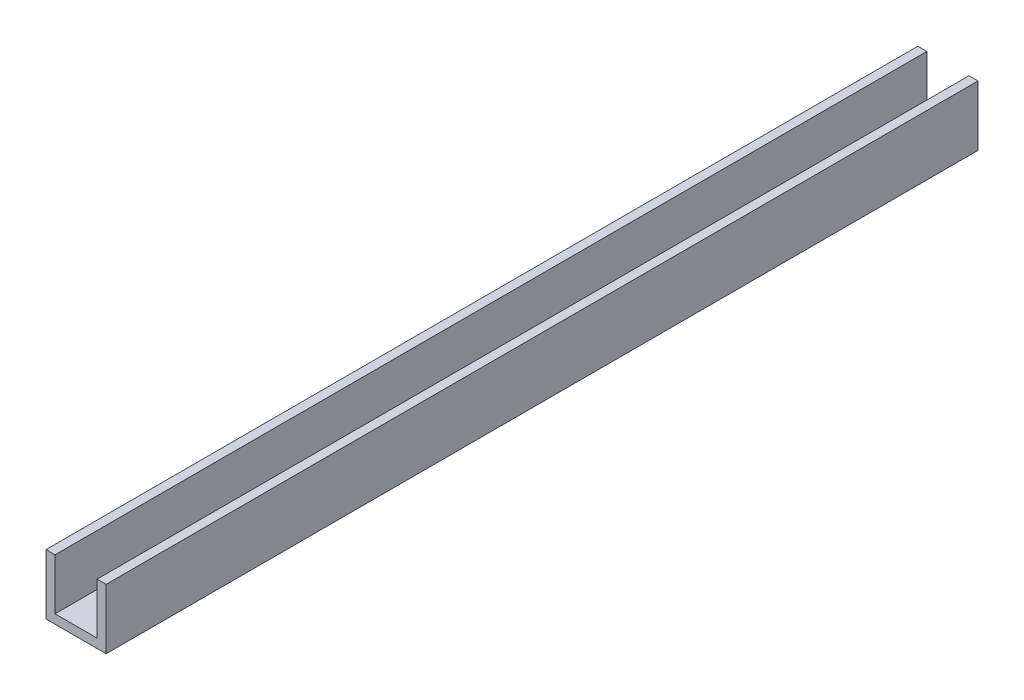
ISO-10303-21;
HEADER;
FILE_DESCRIPTION(('STEP AP214'),'2;1');
FILE_NAME('part.step','',(''),(''),'','','');
FILE_SCHEMA(('AUTOMOTIVE_DESIGN { 1 0 10303 214 1 1 1 1 }'));
ENDSEC;
DATA;
#1=APPLICATION_CONTEXT('core data for automotive mechanical design processes');
#2=APPLICATION_PROTOCOL_DEFINITION('international standard','automotive_design',2000,#1);
#3=PRODUCT_CONTEXT('',#1,'mechanical');
#4=PRODUCT('Part','Part','',(#3));
#5=PRODUCT_RELATED_PRODUCT_CATEGORY('part','',(#4));
#6=PRODUCT_DEFINITION_FORMATION('','',#4);
#7=PRODUCT_DEFINITION_CONTEXT('part definition',#1,'design');
#8=PRODUCT_DEFINITION('design','',#6,#7);
#9=PRODUCT_DEFINITION_SHAPE('','',#8);
#10=(LENGTH_UNIT() NAMED_UNIT(*) SI_UNIT(.MILLI.,.METRE.));
#11=(NAMED_UNIT(*) PLANE_ANGLE_UNIT() SI_UNIT($,.RADIAN.));
#12=(NAMED_UNIT(*) SI_UNIT($,.STERADIAN.) SOLID_ANGLE_UNIT());
#13=UNCERTAINTY_MEASURE_WITH_UNIT(LENGTH_MEASURE(1.E-05),#10,'distance_accuracy_value','');
#14=(GEOMETRIC_REPRESENTATION_CONTEXT(3) GLOBAL_UNCERTAINTY_ASSIGNED_CONTEXT((#13)) GLOBAL_UNIT_ASSIGNED_CONTEXT((#10,
#11,#12)) REPRESENTATION_CONTEXT('',''));
#15=CARTESIAN_POINT('',(0.,0.,0.));
#16=DIRECTION('',(0.,0.,1.));
#17=DIRECTION('',(1.,0.,0.));
#18=AXIS2_PLACEMENT_3D('',#15,#16,#17);
#19=CARTESIAN_POINT('',(0.,10.,144.94));
#20=DIRECTION('',(1.,0.,0.));
#21=DIRECTION('',(0.,1.,0.));
#22=AXIS2_PLACEMENT_3D('',#19,#20,#21);
#23=PLANE('',#22);
#24=DIRECTION('',(0.,-1.,0.));
#25=VECTOR('',#24,1.);
#26=CARTESIAN_POINT('',(0.,10.,0.));
#27=LINE('',#26,#25);
#28=CARTESIAN_POINT('',(0.,10.,0.));
#29=VERTEX_POINT('',#28);
#30=CARTESIAN_POINT('',(0.,0.,0.));
#31=VERTEX_POINT('',#30);
#32=EDGE_CURVE('E129',#29,#31,#27,.T.);
#33=ORIENTED_EDGE('',*,*,#32,.T.);
#34=DIRECTION('',(0.,0.,-1.));
#35=VECTOR('',#34,1.);
#36=CARTESIAN_POINT('',(0.,0.,144.94));
#37=LINE('',#36,#35);
#38=CARTESIAN_POINT('',(0.,0.,144.94));
#39=VERTEX_POINT('',#38);
#40=EDGE_CURVE('E11',#39,#31,#37,.T.);
#41=ORIENTED_EDGE('',*,*,#40,.F.);
#42=DIRECTION('',(0.,-1.,0.));
#43=VECTOR('',#42,1.);
#44=CARTESIAN_POINT('',(0.,10.,144.94));
#45=LINE('',#44,#43);
#46=CARTESIAN_POINT('',(0.,10.,144.94));
#47=VERTEX_POINT('',#46);
#48=EDGE_CURVE('E143',#47,#39,#45,.T.);
#49=ORIENTED_EDGE('',*,*,#48,.F.);
#50=DIRECTION('',(0.,0.,-1.));
#51=VECTOR('',#50,1.);
#52=CARTESIAN_POINT('',(0.,10.,144.94));
#53=LINE('',#52,#51);
#54=EDGE_CURVE('E125',#47,#29,#53,.T.);
#55=ORIENTED_EDGE('',*,*,#54,.T.);
#56=EDGE_LOOP('',(#33,#41,#49,#55));
#57=FACE_BOUND('',#56,.T.);
#58=ADVANCED_FACE('F33',(#57),#23,.F.);
#59=CARTESIAN_POINT('',(0.,0.,144.94));
#60=DIRECTION('',(0.,1.,0.));
#61=DIRECTION('',(0.,0.,1.));
#62=AXIS2_PLACEMENT_3D('',#59,#60,#61);
#63=PLANE('',#62);
#64=DIRECTION('',(1.,0.,0.));
#65=VECTOR('',#64,1.);
#66=CARTESIAN_POINT('',(0.,0.,0.));
#67=LINE('',#66,#65);
#68=CARTESIAN_POINT('',(10.,0.,0.));
#69=VERTEX_POINT('',#68);
#70=EDGE_CURVE('E132',#31,#69,#67,.T.);
#71=ORIENTED_EDGE('',*,*,#70,.T.);
#72=DIRECTION('',(0.,0.,-1.));
#73=VECTOR('',#72,1.);
#74=CARTESIAN_POINT('',(10.,0.,144.94));
#75=LINE('',#74,#73);
#76=CARTESIAN_POINT('',(10.,0.,144.94));
#77=VERTEX_POINT('',#76);
#78=EDGE_CURVE('E41',#77,#69,#75,.T.);
#79=ORIENTED_EDGE('',*,*,#78,.F.);
#80=DIRECTION('',(1.,0.,0.));
#81=VECTOR('',#80,1.);
#82=CARTESIAN_POINT('',(0.,0.,144.94));
#83=LINE('',#82,#81);
#84=EDGE_CURVE('E92',#39,#77,#83,.T.);
#85=ORIENTED_EDGE('',*,*,#84,.F.);
#86=ORIENTED_EDGE('',*,*,#40,.T.);
#87=EDGE_LOOP('',(#71,#79,#85,#86));
#88=FACE_BOUND('',#87,.T.);
#89=ADVANCED_FACE('F178',(#88),#63,.F.);
#90=CARTESIAN_POINT('',(10.,0.,144.94));
#91=DIRECTION('',(-1.,0.,0.));
#92=DIRECTION('',(0.,0.,1.));
#93=AXIS2_PLACEMENT_3D('',#90,#91,#92);
#94=PLANE('',#93);
#95=DIRECTION('',(0.,1.,0.));
#96=VECTOR('',#95,1.);
#97=CARTESIAN_POINT('',(10.,0.,0.));
#98=LINE('',#97,#96);
#99=CARTESIAN_POINT('',(10.,10.,0.));
#100=VERTEX_POINT('',#99);
#101=EDGE_CURVE('E134',#69,#100,#98,.T.);
#102=ORIENTED_EDGE('',*,*,#101,.T.);
#103=DIRECTION('',(0.,0.,-1.));
#104=VECTOR('',#103,1.);
#105=CARTESIAN_POINT('',(10.,10.,144.94));
#106=LINE('',#105,#104);
#107=CARTESIAN_POINT('',(10.,10.,144.94));
#108=VERTEX_POINT('',#107);
#109=EDGE_CURVE('E150',#108,#100,#106,.T.);
#110=ORIENTED_EDGE('',*,*,#109,.F.);
#111=DIRECTION('',(0.,1.,0.));
#112=VECTOR('',#111,1.);
#113=CARTESIAN_POINT('',(10.,0.,144.94));
#114=LINE('',#113,#112);
#115=EDGE_CURVE('E158',#77,#108,#114,.T.);
#116=ORIENTED_EDGE('',*,*,#115,.F.);
#117=ORIENTED_EDGE('',*,*,#78,.T.);
#118=EDGE_LOOP('',(#102,#110,#116,#117));
#119=FACE_BOUND('',#118,.T.);
#120=ADVANCED_FACE('F156',(#119),#94,.F.);
#121=CARTESIAN_POINT('',(10.,10.,144.94));
#122=DIRECTION('',(0.,-1.,0.));
#123=DIRECTION('',(1.,0.,0.));
#124=AXIS2_PLACEMENT_3D('',#121,#122,#123);
#125=PLANE('',#124);
#126=DIRECTION('',(-1.,0.,0.));
#127=VECTOR('',#126,1.);
#128=CARTESIAN_POINT('',(10.,10.,0.));
#129=LINE('',#128,#127);
#130=CARTESIAN_POINT('',(8.5,10.,0.));
#131=VERTEX_POINT('',#130);
#132=EDGE_CURVE('E136',#100,#131,#129,.T.);
#133=ORIENTED_EDGE('',*,*,#132,.T.);
#134=DIRECTION('',(0.,0.,-1.));
#135=VECTOR('',#134,1.);
#136=CARTESIAN_POINT('',(8.5,10.,144.94));
#137=LINE('',#136,#135);
#138=CARTESIAN_POINT('',(8.5,10.,144.94));
#139=VERTEX_POINT('',#138);
#140=EDGE_CURVE('E147',#139,#131,#137,.T.);
#141=ORIENTED_EDGE('',*,*,#140,.F.);
#142=DIRECTION('',(-1.,0.,0.));
#143=VECTOR('',#142,1.);
#144=CARTESIAN_POINT('',(10.,10.,144.94));
#145=LINE('',#144,#143);
#146=EDGE_CURVE('E170',#108,#139,#145,.T.);
#147=ORIENTED_EDGE('',*,*,#146,.F.);
#148=ORIENTED_EDGE('',*,*,#109,.T.);
#149=EDGE_LOOP('',(#133,#141,#147,#148));
#150=FACE_BOUND('',#149,.T.);
#151=ADVANCED_FACE('F166',(#150),#125,.F.);
#152=CARTESIAN_POINT('',(8.5,10.,144.94));
#153=DIRECTION('',(1.,0.,0.));
#154=DIRECTION('',(0.,0.,-1.));
#155=AXIS2_PLACEMENT_3D('',#152,#153,#154);
#156=PLANE('',#155);
#157=DIRECTION('',(0.,-1.,0.));
#158=VECTOR('',#157,1.);
#159=CARTESIAN_POINT('',(8.5,10.,0.));
#160=LINE('',#159,#158);
#161=CARTESIAN_POINT('',(8.5,1.5,0.));
#162=VERTEX_POINT('',#161);
#163=EDGE_CURVE('E138',#131,#162,#160,.T.);
#164=ORIENTED_EDGE('',*,*,#163,.T.);
#165=DIRECTION('',(0.,0.,-1.));
#166=VECTOR('',#165,1.);
#167=CARTESIAN_POINT('',(8.5,1.5,144.94));
#168=LINE('',#167,#166);
#169=CARTESIAN_POINT('',(8.5,1.5,144.94));
#170=VERTEX_POINT('',#169);
#171=EDGE_CURVE('E120',#170,#162,#168,.T.);
#172=ORIENTED_EDGE('',*,*,#171,.F.);
#173=DIRECTION('',(0.,-1.,0.));
#174=VECTOR('',#173,1.);
#175=CARTESIAN_POINT('',(8.5,10.,144.94));
#176=LINE('',#175,#174);
#177=EDGE_CURVE('E111',#139,#170,#176,.T.);
#178=ORIENTED_EDGE('',*,*,#177,.F.);
#179=ORIENTED_EDGE('',*,*,#140,.T.);
#180=EDGE_LOOP('',(#164,#172,#178,#179));
#181=FACE_BOUND('',#180,.T.);
#182=ADVANCED_FACE('F169',(#181),#156,.F.);
#183=CARTESIAN_POINT('',(8.5,1.5,144.94));
#184=DIRECTION('',(0.,-1.,0.));
#185=DIRECTION('',(1.,0.,0.));
#186=AXIS2_PLACEMENT_3D('',#183,#184,#185);
#187=PLANE('',#186);
#188=DIRECTION('',(-1.,0.,0.));
#189=VECTOR('',#188,1.);
#190=CARTESIAN_POINT('',(8.5,1.5,0.));
#191=LINE('',#190,#189);
#192=CARTESIAN_POINT('',(1.5,1.5,0.));
#193=VERTEX_POINT('',#192);
#194=EDGE_CURVE('E119',#162,#193,#191,.T.);
#195=ORIENTED_EDGE('',*,*,#194,.T.);
#196=DIRECTION('',(0.,0.,-1.));
#197=VECTOR('',#196,1.);
#198=CARTESIAN_POINT('',(1.5,1.5,144.94));
#199=LINE('',#198,#197);
#200=CARTESIAN_POINT('',(1.5,1.5,144.94));
#201=VERTEX_POINT('',#200);
#202=EDGE_CURVE('E116',#201,#193,#199,.T.);
#203=ORIENTED_EDGE('',*,*,#202,.F.);
#204=DIRECTION('',(-1.,0.,0.));
#205=VECTOR('',#204,1.);
#206=CARTESIAN_POINT('',(8.5,1.5,144.94));
#207=LINE('',#206,#205);
#208=EDGE_CURVE('E105',#170,#201,#207,.T.);
#209=ORIENTED_EDGE('',*,*,#208,.F.);
#210=ORIENTED_EDGE('',*,*,#171,.T.);
#211=EDGE_LOOP('',(#195,#203,#209,#210));
#212=FACE_BOUND('',#211,.T.);
#213=ADVANCED_FACE('F117',(#212),#187,.F.);
#214=CARTESIAN_POINT('',(1.5,1.5,144.94));
#215=DIRECTION('',(-1.,0.,0.));
#216=DIRECTION('',(0.,-1.,0.));
#217=AXIS2_PLACEMENT_3D('',#214,#215,#216);
#218=PLANE('',#217);
#219=DIRECTION('',(0.,1.,0.));
#220=VECTOR('',#219,1.);
#221=CARTESIAN_POINT('',(1.5,1.5,0.));
#222=LINE('',#221,#220);
#223=CARTESIAN_POINT('',(1.5,10.,0.));
#224=VERTEX_POINT('',#223);
#225=EDGE_CURVE('E78',#193,#224,#222,.T.);
#226=ORIENTED_EDGE('',*,*,#225,.T.);
#227=DIRECTION('',(0.,0.,-1.));
#228=VECTOR('',#227,1.);
#229=CARTESIAN_POINT('',(1.5,10.,144.94));
#230=LINE('',#229,#228);
#231=CARTESIAN_POINT('',(1.5,10.,144.94));
#232=VERTEX_POINT('',#231);
#233=EDGE_CURVE('E121',#232,#224,#230,.T.);
#234=ORIENTED_EDGE('',*,*,#233,.F.);
#235=DIRECTION('',(0.,1.,0.));
#236=VECTOR('',#235,1.);
#237=CARTESIAN_POINT('',(1.5,1.5,144.94));
#238=LINE('',#237,#236);
#239=EDGE_CURVE('E109',#201,#232,#238,.T.);
#240=ORIENTED_EDGE('',*,*,#239,.F.);
#241=ORIENTED_EDGE('',*,*,#202,.T.);
#242=EDGE_LOOP('',(#226,#234,#240,#241));
#243=FACE_BOUND('',#242,.T.);
#244=ADVANCED_FACE('F123',(#243),#218,.F.);
#245=CARTESIAN_POINT('',(1.5,10.,144.94));
#246=DIRECTION('',(0.,-1.,0.));
#247=DIRECTION('',(0.,0.,-1.));
#248=AXIS2_PLACEMENT_3D('',#245,#246,#247);
#249=PLANE('',#248);
#250=DIRECTION('',(-1.,0.,0.));
#251=VECTOR('',#250,1.);
#252=CARTESIAN_POINT('',(1.5,10.,0.));
#253=LINE('',#252,#251);
#254=EDGE_CURVE('E84',#224,#29,#253,.T.);
#255=ORIENTED_EDGE('',*,*,#254,.T.);
#256=ORIENTED_EDGE('',*,*,#54,.F.);
#257=DIRECTION('',(-1.,0.,0.));
#258=VECTOR('',#257,1.);
#259=CARTESIAN_POINT('',(1.5,10.,144.94));
#260=LINE('',#259,#258);
#261=EDGE_CURVE('E49',#232,#47,#260,.T.);
#262=ORIENTED_EDGE('',*,*,#261,.F.);
#263=ORIENTED_EDGE('',*,*,#233,.T.);
#264=EDGE_LOOP('',(#255,#256,#262,#263));
#265=FACE_BOUND('',#264,.T.);
#266=ADVANCED_FACE('F194',(#265),#249,.F.);
#267=CARTESIAN_POINT('',(0.,0.,144.94));
#268=DIRECTION('',(0.,0.,1.));
#269=DIRECTION('',(1.,0.,0.));
#270=AXIS2_PLACEMENT_3D('',#267,#268,#269);
#271=PLANE('',#270);
#272=ORIENTED_EDGE('',*,*,#48,.T.);
#273=ORIENTED_EDGE('',*,*,#84,.T.);
#274=ORIENTED_EDGE('',*,*,#115,.T.);
#275=ORIENTED_EDGE('',*,*,#146,.T.);
#276=ORIENTED_EDGE('',*,*,#177,.T.);
#277=ORIENTED_EDGE('',*,*,#208,.T.);
#278=ORIENTED_EDGE('',*,*,#239,.T.);
#279=ORIENTED_EDGE('',*,*,#261,.T.);
#280=EDGE_LOOP('',(#272,#273,#274,#275,#276,#277,#278,#279));
#281=FACE_BOUND('',#280,.T.);
#282=ADVANCED_FACE('F107',(#281),#271,.T.);
#283=CARTESIAN_POINT('',(0.,0.,0.));
#284=DIRECTION('',(0.,0.,1.));
#285=DIRECTION('',(1.,0.,0.));
#286=AXIS2_PLACEMENT_3D('',#283,#284,#285);
#287=PLANE('',#286);
#288=ORIENTED_EDGE('',*,*,#32,.F.);
#289=ORIENTED_EDGE('',*,*,#254,.F.);
#290=ORIENTED_EDGE('',*,*,#225,.F.);
#291=ORIENTED_EDGE('',*,*,#194,.F.);
#292=ORIENTED_EDGE('',*,*,#163,.F.);
#293=ORIENTED_EDGE('',*,*,#132,.F.);
#294=ORIENTED_EDGE('',*,*,#101,.F.);
#295=ORIENTED_EDGE('',*,*,#70,.F.);
#296=EDGE_LOOP('',(#288,#289,#290,#291,#292,#293,#294,#295));
#297=FACE_BOUND('',#296,.T.);
#298=ADVANCED_FACE('F162',(#297),#287,.F.);
#299=CLOSED_SHELL('',(#58,#89,#120,#151,#182,#213,#244,#266,#282,#298));
#300=MANIFOLD_SOLID_BREP('B2',#299);
#301=ADVANCED_BREP_SHAPE_REPRESENTATION('',(#18,#300),#14);
#302=SHAPE_DEFINITION_REPRESENTATION(#9,#301);
ENDSEC;
END-ISO-10303-21;
